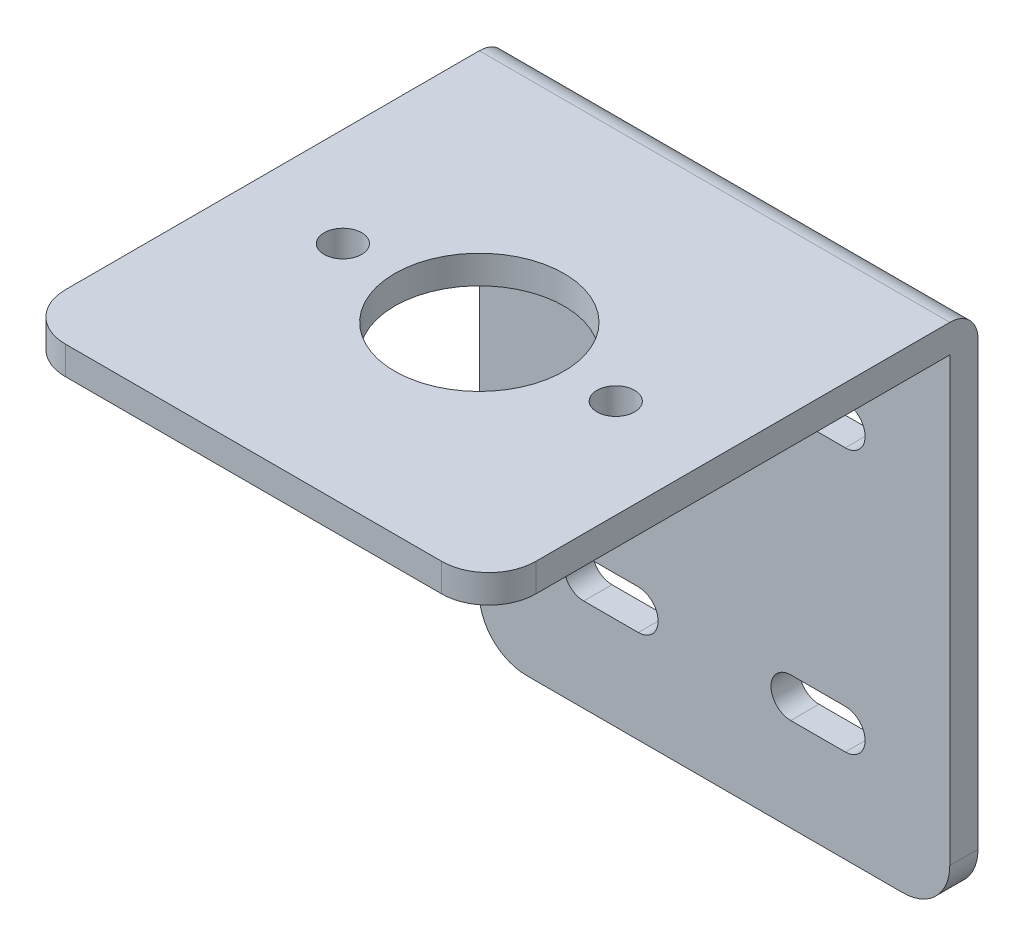
ISO-10303-21;
HEADER;
FILE_DESCRIPTION(('STEP AP214'),'2;1');
FILE_NAME('part.step','',(''),(''),'','','');
FILE_SCHEMA(('AUTOMOTIVE_DESIGN { 1 0 10303 214 1 1 1 1 }'));
ENDSEC;
DATA;
#1=APPLICATION_CONTEXT('core data for automotive mechanical design processes');
#2=APPLICATION_PROTOCOL_DEFINITION('international standard','automotive_design',2000,#1);
#3=PRODUCT_CONTEXT('',#1,'mechanical');
#4=PRODUCT('Part','Part','',(#3));
#5=PRODUCT_RELATED_PRODUCT_CATEGORY('part','',(#4));
#6=PRODUCT_DEFINITION_FORMATION('','',#4);
#7=PRODUCT_DEFINITION_CONTEXT('part definition',#1,'design');
#8=PRODUCT_DEFINITION('design','',#6,#7);
#9=PRODUCT_DEFINITION_SHAPE('','',#8);
#10=(LENGTH_UNIT() NAMED_UNIT(*) SI_UNIT(.MILLI.,.METRE.));
#11=(NAMED_UNIT(*) PLANE_ANGLE_UNIT() SI_UNIT($,.RADIAN.));
#12=(NAMED_UNIT(*) SI_UNIT($,.STERADIAN.) SOLID_ANGLE_UNIT());
#13=UNCERTAINTY_MEASURE_WITH_UNIT(LENGTH_MEASURE(1.E-05),#10,'distance_accuracy_value','');
#14=(GEOMETRIC_REPRESENTATION_CONTEXT(3) GLOBAL_UNCERTAINTY_ASSIGNED_CONTEXT((#13)) GLOBAL_UNIT_ASSIGNED_CONTEXT((#10,
#11,#12)) REPRESENTATION_CONTEXT('',''));
#15=CARTESIAN_POINT('',(0.,0.,0.));
#16=DIRECTION('',(0.,0.,1.));
#17=DIRECTION('',(1.,0.,0.));
#18=AXIS2_PLACEMENT_3D('',#15,#16,#17);
#19=CARTESIAN_POINT('',(50.,0.,0.));
#20=DIRECTION('',(0.,0.,-1.));
#21=DIRECTION('',(0.,-1.,0.));
#22=AXIS2_PLACEMENT_3D('',#19,#20,#21);
#23=PLANE('',#22);
#24=CARTESIAN_POINT('',(38.9,-12.,0.));
#25=DIRECTION('',(0.,0.,-1.));
#26=DIRECTION('',(0.707106781186548,0.707106781186548,0.));
#27=AXIS2_PLACEMENT_3D('',#24,#25,#26);
#28=CIRCLE('',#27,2.1);
#29=CARTESIAN_POINT('',(38.9,-9.9,0.));
#30=VERTEX_POINT('',#29);
#31=CARTESIAN_POINT('',(38.9,-14.1,0.));
#32=VERTEX_POINT('',#31);
#33=EDGE_CURVE('E595',#30,#32,#28,.T.);
#34=ORIENTED_EDGE('',*,*,#33,.F.);
#35=DIRECTION('',(1.,0.,0.));
#36=VECTOR('',#35,1.);
#37=CARTESIAN_POINT('',(31.,-9.9,0.));
#38=LINE('',#37,#36);
#39=CARTESIAN_POINT('',(33.1,-9.9,0.));
#40=VERTEX_POINT('',#39);
#41=EDGE_CURVE('E351',#40,#30,#38,.T.);
#42=ORIENTED_EDGE('',*,*,#41,.F.);
#43=CARTESIAN_POINT('',(33.1,-12.,0.));
#44=DIRECTION('',(0.,0.,-1.));
#45=DIRECTION('',(-0.707106781186548,-0.707106781186548,0.));
#46=AXIS2_PLACEMENT_3D('',#43,#44,#45);
#47=CIRCLE('',#46,2.1);
#48=CARTESIAN_POINT('',(33.1,-14.1,0.));
#49=VERTEX_POINT('',#48);
#50=EDGE_CURVE('E339',#49,#40,#47,.T.);
#51=ORIENTED_EDGE('',*,*,#50,.F.);
#52=DIRECTION('',(-1.,0.,0.));
#53=VECTOR('',#52,1.);
#54=CARTESIAN_POINT('',(41.,-14.1,0.));
#55=LINE('',#54,#53);
#56=EDGE_CURVE('E424',#32,#49,#55,.T.);
#57=ORIENTED_EDGE('',*,*,#56,.F.);
#58=EDGE_LOOP('',(#34,#42,#51,#57));
#59=FACE_BOUND('',#58,.T.);
#60=CARTESIAN_POINT('',(33.1,-40.,0.));
#61=DIRECTION('',(0.,0.,-1.));
#62=DIRECTION('',(-0.707106781186546,-0.707106781186549,0.));
#63=AXIS2_PLACEMENT_3D('',#60,#61,#62);
#64=CIRCLE('',#63,2.1);
#65=CARTESIAN_POINT('',(33.1,-42.1,0.));
#66=VERTEX_POINT('',#65);
#67=CARTESIAN_POINT('',(33.1,-37.9,0.));
#68=VERTEX_POINT('',#67);
#69=EDGE_CURVE('E25',#66,#68,#64,.T.);
#70=ORIENTED_EDGE('',*,*,#69,.F.);
#71=DIRECTION('',(-1.,0.,0.));
#72=VECTOR('',#71,1.);
#73=CARTESIAN_POINT('',(31.,-42.1,0.));
#74=LINE('',#73,#72);
#75=CARTESIAN_POINT('',(38.9000006109476,-42.1,0.));
#76=VERTEX_POINT('',#75);
#77=EDGE_CURVE('E329',#76,#66,#74,.T.);
#78=ORIENTED_EDGE('',*,*,#77,.F.);
#79=CARTESIAN_POINT('',(38.9000006109476,-40.,0.));
#80=DIRECTION('',(0.,0.,-1.));
#81=DIRECTION('',(0.707106781186548,0.707106781186548,0.));
#82=AXIS2_PLACEMENT_3D('',#79,#80,#81);
#83=CIRCLE('',#82,2.1);
#84=CARTESIAN_POINT('',(38.9000006109476,-37.9,0.));
#85=VERTEX_POINT('',#84);
#86=EDGE_CURVE('E427',#85,#76,#83,.T.);
#87=ORIENTED_EDGE('',*,*,#86,.F.);
#88=DIRECTION('',(1.,0.,0.));
#89=VECTOR('',#88,1.);
#90=CARTESIAN_POINT('',(41.0000006109476,-37.9,0.));
#91=LINE('',#90,#89);
#92=EDGE_CURVE('E493',#68,#85,#91,.T.);
#93=ORIENTED_EDGE('',*,*,#92,.F.);
#94=EDGE_LOOP('',(#70,#78,#87,#93));
#95=FACE_BOUND('',#94,.T.);
#96=CARTESIAN_POINT('',(16.9,-12.,0.));
#97=DIRECTION('',(0.,0.,-1.));
#98=DIRECTION('',(0.707106781186548,0.707106781186548,0.));
#99=AXIS2_PLACEMENT_3D('',#96,#97,#98);
#100=CIRCLE('',#99,2.1);
#101=CARTESIAN_POINT('',(16.9,-9.9,0.));
#102=VERTEX_POINT('',#101);
#103=CARTESIAN_POINT('',(16.9,-14.1,0.));
#104=VERTEX_POINT('',#103);
#105=EDGE_CURVE('E423',#102,#104,#100,.T.);
#106=ORIENTED_EDGE('',*,*,#105,.F.);
#107=DIRECTION('',(1.,0.,0.));
#108=VECTOR('',#107,1.);
#109=CARTESIAN_POINT('',(19.,-9.9,0.));
#110=LINE('',#109,#108);
#111=CARTESIAN_POINT('',(11.1,-9.9,0.));
#112=VERTEX_POINT('',#111);
#113=EDGE_CURVE('E484',#112,#102,#110,.T.);
#114=ORIENTED_EDGE('',*,*,#113,.F.);
#115=CARTESIAN_POINT('',(11.1,-12.,0.));
#116=DIRECTION('',(0.,0.,-1.));
#117=DIRECTION('',(-0.707106781186548,-0.707106781186548,0.));
#118=AXIS2_PLACEMENT_3D('',#115,#116,#117);
#119=CIRCLE('',#118,2.1);
#120=CARTESIAN_POINT('',(11.1,-14.1,0.));
#121=VERTEX_POINT('',#120);
#122=EDGE_CURVE('E39',#121,#112,#119,.T.);
#123=ORIENTED_EDGE('',*,*,#122,.F.);
#124=DIRECTION('',(-1.,0.,0.));
#125=VECTOR('',#124,1.);
#126=CARTESIAN_POINT('',(9.,-14.1,0.));
#127=LINE('',#126,#125);
#128=EDGE_CURVE('E359',#104,#121,#127,.T.);
#129=ORIENTED_EDGE('',*,*,#128,.F.);
#130=EDGE_LOOP('',(#106,#114,#123,#129));
#131=FACE_BOUND('',#130,.T.);
#132=CARTESIAN_POINT('',(16.9,-40.,0.));
#133=DIRECTION('',(0.,0.,-1.));
#134=DIRECTION('',(0.707106781186548,0.707106781186548,0.));
#135=AXIS2_PLACEMENT_3D('',#132,#133,#134);
#136=CIRCLE('',#135,2.1);
#137=CARTESIAN_POINT('',(16.9,-37.9,0.));
#138=VERTEX_POINT('',#137);
#139=CARTESIAN_POINT('',(16.9,-42.1,0.));
#140=VERTEX_POINT('',#139);
#141=EDGE_CURVE('E310',#138,#140,#136,.T.);
#142=ORIENTED_EDGE('',*,*,#141,.F.);
#143=DIRECTION('',(1.,0.,0.));
#144=VECTOR('',#143,1.);
#145=CARTESIAN_POINT('',(19.,-37.9,0.));
#146=LINE('',#145,#144);
#147=CARTESIAN_POINT('',(11.1,-37.9,0.));
#148=VERTEX_POINT('',#147);
#149=EDGE_CURVE('E294',#148,#138,#146,.T.);
#150=ORIENTED_EDGE('',*,*,#149,.F.);
#151=CARTESIAN_POINT('',(11.1,-40.,0.));
#152=DIRECTION('',(0.,0.,-1.));
#153=DIRECTION('',(-0.707106781186546,-0.707106781186549,0.));
#154=AXIS2_PLACEMENT_3D('',#151,#152,#153);
#155=CIRCLE('',#154,2.1);
#156=CARTESIAN_POINT('',(11.1,-42.1,0.));
#157=VERTEX_POINT('',#156);
#158=EDGE_CURVE('E9',#157,#148,#155,.T.);
#159=ORIENTED_EDGE('',*,*,#158,.F.);
#160=DIRECTION('',(-1.,0.,0.));
#161=VECTOR('',#160,1.);
#162=CARTESIAN_POINT('',(9.,-42.1,0.));
#163=LINE('',#162,#161);
#164=EDGE_CURVE('E314',#140,#157,#163,.T.);
#165=ORIENTED_EDGE('',*,*,#164,.F.);
#166=EDGE_LOOP('',(#142,#150,#159,#165));
#167=FACE_BOUND('',#166,.T.);
#168=DIRECTION('',(-1.,0.,0.));
#169=VECTOR('',#168,1.);
#170=CARTESIAN_POINT('',(50.,0.,0.));
#171=LINE('',#170,#169);
#172=CARTESIAN_POINT('',(50.,0.,0.));
#173=VERTEX_POINT('',#172);
#174=CARTESIAN_POINT('',(0.,0.,0.));
#175=VERTEX_POINT('',#174);
#176=EDGE_CURVE('E18',#173,#175,#171,.T.);
#177=ORIENTED_EDGE('',*,*,#176,.F.);
#178=DIRECTION('',(0.,-1.,0.));
#179=VECTOR('',#178,1.);
#180=CARTESIAN_POINT('',(50.,0.,0.));
#181=LINE('',#180,#179);
#182=CARTESIAN_POINT('',(50.,-47.,0.));
#183=VERTEX_POINT('',#182);
#184=EDGE_CURVE('E481',#173,#183,#181,.T.);
#185=ORIENTED_EDGE('',*,*,#184,.T.);
#186=CARTESIAN_POINT('',(45.,-47.,0.));
#187=DIRECTION('',(0.,0.,1.));
#188=DIRECTION('',(0.707106781186548,-0.707106781186548,0.));
#189=AXIS2_PLACEMENT_3D('',#186,#187,#188);
#190=CIRCLE('',#189,5.);
#191=CARTESIAN_POINT('',(45.,-52.,0.));
#192=VERTEX_POINT('',#191);
#193=EDGE_CURVE('E547',#192,#183,#190,.T.);
#194=ORIENTED_EDGE('',*,*,#193,.F.);
#195=DIRECTION('',(-1.,0.,0.));
#196=VECTOR('',#195,1.);
#197=CARTESIAN_POINT('',(50.,-52.,0.));
#198=LINE('',#197,#196);
#199=CARTESIAN_POINT('',(5.,-52.,0.));
#200=VERTEX_POINT('',#199);
#201=EDGE_CURVE('E519',#192,#200,#198,.T.);
#202=ORIENTED_EDGE('',*,*,#201,.T.);
#203=CARTESIAN_POINT('',(5.,-47.,0.));
#204=DIRECTION('',(0.,0.,1.));
#205=DIRECTION('',(-0.707106781186548,-0.707106781186548,0.));
#206=AXIS2_PLACEMENT_3D('',#203,#204,#205);
#207=CIRCLE('',#206,5.);
#208=CARTESIAN_POINT('',(0.,-47.,0.));
#209=VERTEX_POINT('',#208);
#210=EDGE_CURVE('E399',#209,#200,#207,.T.);
#211=ORIENTED_EDGE('',*,*,#210,.F.);
#212=DIRECTION('',(0.,1.,0.));
#213=VECTOR('',#212,1.);
#214=CARTESIAN_POINT('',(0.,0.,0.));
#215=LINE('',#214,#213);
#216=EDGE_CURVE('E350',#209,#175,#215,.T.);
#217=ORIENTED_EDGE('',*,*,#216,.T.);
#218=EDGE_LOOP('',(#177,#185,#194,#202,#211,#217));
#219=FACE_BOUND('',#218,.T.);
#220=ADVANCED_FACE('F14',(#59,#95,#131,#167,#219),#23,.T.);
#221=CARTESIAN_POINT('',(0.,0.,52.));
#222=DIRECTION('',(0.,0.,1.));
#223=DIRECTION('',(1.,0.,0.));
#224=AXIS2_PLACEMENT_3D('',#221,#222,#223);
#225=PLANE('',#224);
#226=DIRECTION('',(0.,-1.,0.));
#227=VECTOR('',#226,1.);
#228=CARTESIAN_POINT('',(45.,0.,52.));
#229=LINE('',#228,#227);
#230=CARTESIAN_POINT('',(45.,3.,52.));
#231=VERTEX_POINT('',#230);
#232=CARTESIAN_POINT('',(45.,0.,52.));
#233=VERTEX_POINT('',#232);
#234=EDGE_CURVE('E396',#231,#233,#229,.T.);
#235=ORIENTED_EDGE('',*,*,#234,.F.);
#236=DIRECTION('',(-1.,0.,0.));
#237=VECTOR('',#236,1.);
#238=CARTESIAN_POINT('',(0.,3.,52.));
#239=LINE('',#238,#237);
#240=CARTESIAN_POINT('',(5.,3.,52.));
#241=VERTEX_POINT('',#240);
#242=EDGE_CURVE('E380',#231,#241,#239,.T.);
#243=ORIENTED_EDGE('',*,*,#242,.T.);
#244=DIRECTION('',(0.,1.,0.));
#245=VECTOR('',#244,1.);
#246=CARTESIAN_POINT('',(5.,0.,52.));
#247=LINE('',#246,#245);
#248=CARTESIAN_POINT('',(5.,0.,52.));
#249=VERTEX_POINT('',#248);
#250=EDGE_CURVE('E409',#249,#241,#247,.T.);
#251=ORIENTED_EDGE('',*,*,#250,.F.);
#252=DIRECTION('',(1.,0.,0.));
#253=VECTOR('',#252,1.);
#254=CARTESIAN_POINT('',(0.,0.,52.));
#255=LINE('',#254,#253);
#256=EDGE_CURVE('E537',#249,#233,#255,.T.);
#257=ORIENTED_EDGE('',*,*,#256,.T.);
#258=EDGE_LOOP('',(#235,#243,#251,#257));
#259=FACE_BOUND('',#258,.T.);
#260=ADVANCED_FACE('F1323',(#259),#225,.T.);
#261=CARTESIAN_POINT('',(11.1,-40.,0.));
#262=DIRECTION('',(0.,0.,1.));
#263=DIRECTION('',(-0.707106781186546,-0.707106781186549,0.));
#264=AXIS2_PLACEMENT_3D('',#261,#262,#263);
#265=CYLINDRICAL_SURFACE('',#264,2.1);
#266=ORIENTED_EDGE('',*,*,#158,.T.);
#267=DIRECTION('',(0.,0.,1.));
#268=VECTOR('',#267,1.);
#269=CARTESIAN_POINT('',(11.1,-37.9,0.));
#270=LINE('',#269,#268);
#271=CARTESIAN_POINT('',(11.1,-37.9,3.));
#272=VERTEX_POINT('',#271);
#273=EDGE_CURVE('E300',#148,#272,#270,.T.);
#274=ORIENTED_EDGE('',*,*,#273,.T.);
#275=CARTESIAN_POINT('',(11.1,-40.,3.));
#276=DIRECTION('',(0.,0.,1.));
#277=DIRECTION('',(-0.707106781186548,0.707106781186548,0.));
#278=AXIS2_PLACEMENT_3D('',#275,#276,#277);
#279=CIRCLE('',#278,2.1);
#280=CARTESIAN_POINT('',(11.1,-42.1,3.));
#281=VERTEX_POINT('',#280);
#282=EDGE_CURVE('E361',#272,#281,#279,.T.);
#283=ORIENTED_EDGE('',*,*,#282,.T.);
#284=DIRECTION('',(0.,0.,-1.));
#285=VECTOR('',#284,1.);
#286=CARTESIAN_POINT('',(11.1,-42.1,0.));
#287=LINE('',#286,#285);
#288=EDGE_CURVE('E344',#281,#157,#287,.T.);
#289=ORIENTED_EDGE('',*,*,#288,.T.);
#290=EDGE_LOOP('',(#266,#274,#283,#289));
#291=FACE_BOUND('',#290,.T.);
#292=ADVANCED_FACE('F1315',(#291),#265,.F.);
#293=CARTESIAN_POINT('',(33.1,-40.,0.));
#294=DIRECTION('',(0.,0.,1.));
#295=DIRECTION('',(-0.707106781186546,-0.707106781186549,0.));
#296=AXIS2_PLACEMENT_3D('',#293,#294,#295);
#297=CYLINDRICAL_SURFACE('',#296,2.1);
#298=ORIENTED_EDGE('',*,*,#69,.T.);
#299=DIRECTION('',(0.,0.,1.));
#300=VECTOR('',#299,1.);
#301=CARTESIAN_POINT('',(33.1,-37.9,0.));
#302=LINE('',#301,#300);
#303=CARTESIAN_POINT('',(33.1,-37.9,3.));
#304=VERTEX_POINT('',#303);
#305=EDGE_CURVE('E354',#68,#304,#302,.T.);
#306=ORIENTED_EDGE('',*,*,#305,.T.);
#307=CARTESIAN_POINT('',(33.1,-40.,3.));
#308=DIRECTION('',(0.,0.,1.));
#309=DIRECTION('',(-0.707106781186548,0.707106781186548,0.));
#310=AXIS2_PLACEMENT_3D('',#307,#308,#309);
#311=CIRCLE('',#310,2.1);
#312=CARTESIAN_POINT('',(33.1,-42.1,3.));
#313=VERTEX_POINT('',#312);
#314=EDGE_CURVE('E428',#304,#313,#311,.T.);
#315=ORIENTED_EDGE('',*,*,#314,.T.);
#316=DIRECTION('',(0.,0.,-1.));
#317=VECTOR('',#316,1.);
#318=CARTESIAN_POINT('',(33.1,-42.1,0.));
#319=LINE('',#318,#317);
#320=EDGE_CURVE('E321',#313,#66,#319,.T.);
#321=ORIENTED_EDGE('',*,*,#320,.T.);
#322=EDGE_LOOP('',(#298,#306,#315,#321));
#323=FACE_BOUND('',#322,.T.);
#324=ADVANCED_FACE('F627',(#323),#297,.F.);
#325=CARTESIAN_POINT('',(11.1,-12.,0.));
#326=DIRECTION('',(0.,0.,1.));
#327=DIRECTION('',(-0.707106781186548,-0.707106781186548,0.));
#328=AXIS2_PLACEMENT_3D('',#325,#326,#327);
#329=CYLINDRICAL_SURFACE('',#328,2.1);
#330=ORIENTED_EDGE('',*,*,#122,.T.);
#331=DIRECTION('',(0.,0.,1.));
#332=VECTOR('',#331,1.);
#333=CARTESIAN_POINT('',(11.1,-9.9,0.));
#334=LINE('',#333,#332);
#335=CARTESIAN_POINT('',(11.1,-9.9,3.));
#336=VERTEX_POINT('',#335);
#337=EDGE_CURVE('E304',#112,#336,#334,.T.);
#338=ORIENTED_EDGE('',*,*,#337,.T.);
#339=CARTESIAN_POINT('',(11.1,-12.,3.));
#340=DIRECTION('',(0.,0.,1.));
#341=DIRECTION('',(-0.707106781186548,0.707106781186548,0.));
#342=AXIS2_PLACEMENT_3D('',#339,#340,#341);
#343=CIRCLE('',#342,2.1);
#344=CARTESIAN_POINT('',(11.1,-14.1,3.));
#345=VERTEX_POINT('',#344);
#346=EDGE_CURVE('E486',#336,#345,#343,.T.);
#347=ORIENTED_EDGE('',*,*,#346,.T.);
#348=DIRECTION('',(0.,0.,-1.));
#349=VECTOR('',#348,1.);
#350=CARTESIAN_POINT('',(11.1,-14.1,0.));
#351=LINE('',#350,#349);
#352=EDGE_CURVE('E408',#345,#121,#351,.T.);
#353=ORIENTED_EDGE('',*,*,#352,.T.);
#354=EDGE_LOOP('',(#330,#338,#347,#353));
#355=FACE_BOUND('',#354,.T.);
#356=ADVANCED_FACE('F646',(#355),#329,.F.);
#357=CARTESIAN_POINT('',(9.,-9.9,0.));
#358=DIRECTION('',(0.,-1.,0.));
#359=DIRECTION('',(0.,0.,-1.));
#360=AXIS2_PLACEMENT_3D('',#357,#358,#359);
#361=PLANE('',#360);
#362=DIRECTION('',(0.,0.,-1.));
#363=VECTOR('',#362,1.);
#364=CARTESIAN_POINT('',(16.9,-9.9,0.));
#365=LINE('',#364,#363);
#366=CARTESIAN_POINT('',(16.9,-9.9,3.));
#367=VERTEX_POINT('',#366);
#368=EDGE_CURVE('E355',#367,#102,#365,.T.);
#369=ORIENTED_EDGE('',*,*,#368,.F.);
#370=DIRECTION('',(1.,0.,0.));
#371=VECTOR('',#370,1.);
#372=CARTESIAN_POINT('',(19.,-9.9,3.));
#373=LINE('',#372,#371);
#374=EDGE_CURVE('E391',#336,#367,#373,.T.);
#375=ORIENTED_EDGE('',*,*,#374,.F.);
#376=ORIENTED_EDGE('',*,*,#337,.F.);
#377=ORIENTED_EDGE('',*,*,#113,.T.);
#378=EDGE_LOOP('',(#369,#375,#376,#377));
#379=FACE_BOUND('',#378,.T.);
#380=ADVANCED_FACE('F650',(#379),#361,.T.);
#381=CARTESIAN_POINT('',(9.,-37.9,0.));
#382=DIRECTION('',(0.,-1.,0.));
#383=DIRECTION('',(0.,0.,-1.));
#384=AXIS2_PLACEMENT_3D('',#381,#382,#383);
#385=PLANE('',#384);
#386=DIRECTION('',(0.,0.,-1.));
#387=VECTOR('',#386,1.);
#388=CARTESIAN_POINT('',(16.9,-37.9,0.));
#389=LINE('',#388,#387);
#390=CARTESIAN_POINT('',(16.9,-37.9,3.));
#391=VERTEX_POINT('',#390);
#392=EDGE_CURVE('E298',#391,#138,#389,.T.);
#393=ORIENTED_EDGE('',*,*,#392,.F.);
#394=DIRECTION('',(1.,0.,0.));
#395=VECTOR('',#394,1.);
#396=CARTESIAN_POINT('',(19.,-37.9,3.));
#397=LINE('',#396,#395);
#398=EDGE_CURVE('E365',#272,#391,#397,.T.);
#399=ORIENTED_EDGE('',*,*,#398,.F.);
#400=ORIENTED_EDGE('',*,*,#273,.F.);
#401=ORIENTED_EDGE('',*,*,#149,.T.);
#402=EDGE_LOOP('',(#393,#399,#400,#401));
#403=FACE_BOUND('',#402,.T.);
#404=ADVANCED_FACE('F296',(#403),#385,.T.);
#405=CARTESIAN_POINT('',(31.,-37.9,0.));
#406=DIRECTION('',(0.,-1.,0.));
#407=DIRECTION('',(0.,0.,-1.));
#408=AXIS2_PLACEMENT_3D('',#405,#406,#407);
#409=PLANE('',#408);
#410=DIRECTION('',(0.,0.,-1.));
#411=VECTOR('',#410,1.);
#412=CARTESIAN_POINT('',(38.9000006109476,-37.9,0.));
#413=LINE('',#412,#411);
#414=CARTESIAN_POINT('',(38.9000006109476,-37.9,3.));
#415=VERTEX_POINT('',#414);
#416=EDGE_CURVE('E556',#415,#85,#413,.T.);
#417=ORIENTED_EDGE('',*,*,#416,.F.);
#418=DIRECTION('',(1.,0.,0.));
#419=VECTOR('',#418,1.);
#420=CARTESIAN_POINT('',(41.0000006109476,-37.9,3.));
#421=LINE('',#420,#419);
#422=EDGE_CURVE('E528',#304,#415,#421,.T.);
#423=ORIENTED_EDGE('',*,*,#422,.F.);
#424=ORIENTED_EDGE('',*,*,#305,.F.);
#425=ORIENTED_EDGE('',*,*,#92,.T.);
#426=EDGE_LOOP('',(#417,#423,#424,#425));
#427=FACE_BOUND('',#426,.T.);
#428=ADVANCED_FACE('F607',(#427),#409,.T.);
#429=CARTESIAN_POINT('',(31.,-9.9,0.));
#430=DIRECTION('',(0.,-1.,0.));
#431=DIRECTION('',(0.,0.,-1.));
#432=AXIS2_PLACEMENT_3D('',#429,#430,#431);
#433=PLANE('',#432);
#434=DIRECTION('',(0.,0.,-1.));
#435=VECTOR('',#434,1.);
#436=CARTESIAN_POINT('',(38.9,-9.9,0.));
#437=LINE('',#436,#435);
#438=CARTESIAN_POINT('',(38.9,-9.9,3.));
#439=VERTEX_POINT('',#438);
#440=EDGE_CURVE('E456',#439,#30,#437,.T.);
#441=ORIENTED_EDGE('',*,*,#440,.F.);
#442=DIRECTION('',(1.,0.,0.));
#443=VECTOR('',#442,1.);
#444=CARTESIAN_POINT('',(31.,-9.9,3.));
#445=LINE('',#444,#443);
#446=CARTESIAN_POINT('',(33.1,-9.9,3.));
#447=VERTEX_POINT('',#446);
#448=EDGE_CURVE('E497',#447,#439,#445,.T.);
#449=ORIENTED_EDGE('',*,*,#448,.F.);
#450=DIRECTION('',(0.,0.,1.));
#451=VECTOR('',#450,1.);
#452=CARTESIAN_POINT('',(33.1,-9.9,0.));
#453=LINE('',#452,#451);
#454=EDGE_CURVE('E343',#40,#447,#453,.T.);
#455=ORIENTED_EDGE('',*,*,#454,.F.);
#456=ORIENTED_EDGE('',*,*,#41,.T.);
#457=EDGE_LOOP('',(#441,#449,#455,#456));
#458=FACE_BOUND('',#457,.T.);
#459=ADVANCED_FACE('F1271',(#458),#433,.T.);
#460=CARTESIAN_POINT('',(33.1,-12.,0.));
#461=DIRECTION('',(0.,0.,1.));
#462=DIRECTION('',(-0.707106781186548,0.707106781186548,0.));
#463=AXIS2_PLACEMENT_3D('',#460,#461,#462);
#464=CYLINDRICAL_SURFACE('',#463,2.1);
#465=ORIENTED_EDGE('',*,*,#50,.T.);
#466=ORIENTED_EDGE('',*,*,#454,.T.);
#467=CARTESIAN_POINT('',(33.1,-12.,3.));
#468=DIRECTION('',(0.,0.,1.));
#469=DIRECTION('',(-0.707106781186548,0.707106781186548,0.));
#470=AXIS2_PLACEMENT_3D('',#467,#468,#469);
#471=CIRCLE('',#470,2.1);
#472=CARTESIAN_POINT('',(33.1,-14.1,3.));
#473=VERTEX_POINT('',#472);
#474=EDGE_CURVE('E442',#447,#473,#471,.T.);
#475=ORIENTED_EDGE('',*,*,#474,.T.);
#476=DIRECTION('',(0.,0.,-1.));
#477=VECTOR('',#476,1.);
#478=CARTESIAN_POINT('',(33.1,-14.1,0.));
#479=LINE('',#478,#477);
#480=EDGE_CURVE('E419',#473,#49,#479,.T.);
#481=ORIENTED_EDGE('',*,*,#480,.T.);
#482=EDGE_LOOP('',(#465,#466,#475,#481));
#483=FACE_BOUND('',#482,.T.);
#484=ADVANCED_FACE('F16',(#483),#464,.F.);
#485=CARTESIAN_POINT('',(19.,-42.1,0.));
#486=DIRECTION('',(0.,1.,0.));
#487=DIRECTION('',(1.,0.,0.));
#488=AXIS2_PLACEMENT_3D('',#485,#486,#487);
#489=PLANE('',#488);
#490=DIRECTION('',(0.,0.,1.));
#491=VECTOR('',#490,1.);
#492=CARTESIAN_POINT('',(16.9,-42.1,0.));
#493=LINE('',#492,#491);
#494=CARTESIAN_POINT('',(16.9,-42.1,3.));
#495=VERTEX_POINT('',#494);
#496=EDGE_CURVE('E315',#140,#495,#493,.T.);
#497=ORIENTED_EDGE('',*,*,#496,.F.);
#498=ORIENTED_EDGE('',*,*,#164,.T.);
#499=ORIENTED_EDGE('',*,*,#288,.F.);
#500=DIRECTION('',(-1.,0.,0.));
#501=VECTOR('',#500,1.);
#502=CARTESIAN_POINT('',(9.,-42.1,3.));
#503=LINE('',#502,#501);
#504=EDGE_CURVE('E366',#495,#281,#503,.T.);
#505=ORIENTED_EDGE('',*,*,#504,.F.);
#506=EDGE_LOOP('',(#497,#498,#499,#505));
#507=FACE_BOUND('',#506,.T.);
#508=ADVANCED_FACE('F1255',(#507),#489,.T.);
#509=CARTESIAN_POINT('',(16.9,-40.,0.));
#510=DIRECTION('',(0.,0.,1.));
#511=DIRECTION('',(0.707106781186546,-0.707106781186549,0.));
#512=AXIS2_PLACEMENT_3D('',#509,#510,#511);
#513=CYLINDRICAL_SURFACE('',#512,2.1);
#514=ORIENTED_EDGE('',*,*,#141,.T.);
#515=ORIENTED_EDGE('',*,*,#496,.T.);
#516=CARTESIAN_POINT('',(16.9,-40.,3.));
#517=DIRECTION('',(0.,0.,1.));
#518=DIRECTION('',(0.707106781186546,-0.707106781186549,0.));
#519=AXIS2_PLACEMENT_3D('',#516,#517,#518);
#520=CIRCLE('',#519,2.1);
#521=EDGE_CURVE('E312',#495,#391,#520,.T.);
#522=ORIENTED_EDGE('',*,*,#521,.T.);
#523=ORIENTED_EDGE('',*,*,#392,.T.);
#524=EDGE_LOOP('',(#514,#515,#522,#523));
#525=FACE_BOUND('',#524,.T.);
#526=ADVANCED_FACE('F309',(#525),#513,.F.);
#527=CARTESIAN_POINT('',(41.0000006109476,-42.1,0.));
#528=DIRECTION('',(0.,1.,0.));
#529=DIRECTION('',(1.,0.,0.));
#530=AXIS2_PLACEMENT_3D('',#527,#528,#529);
#531=PLANE('',#530);
#532=DIRECTION('',(0.,0.,1.));
#533=VECTOR('',#532,1.);
#534=CARTESIAN_POINT('',(38.9000006109476,-42.1,0.));
#535=LINE('',#534,#533);
#536=CARTESIAN_POINT('',(38.9000006109476,-42.1,3.));
#537=VERTEX_POINT('',#536);
#538=EDGE_CURVE('E464',#76,#537,#535,.T.);
#539=ORIENTED_EDGE('',*,*,#538,.F.);
#540=ORIENTED_EDGE('',*,*,#77,.T.);
#541=ORIENTED_EDGE('',*,*,#320,.F.);
#542=DIRECTION('',(-1.,0.,0.));
#543=VECTOR('',#542,1.);
#544=CARTESIAN_POINT('',(31.,-42.1,3.));
#545=LINE('',#544,#543);
#546=EDGE_CURVE('E433',#537,#313,#545,.T.);
#547=ORIENTED_EDGE('',*,*,#546,.F.);
#548=EDGE_LOOP('',(#539,#540,#541,#547));
#549=FACE_BOUND('',#548,.T.);
#550=ADVANCED_FACE('F619',(#549),#531,.T.);
#551=CARTESIAN_POINT('',(38.9000006109476,-40.,0.));
#552=DIRECTION('',(0.,0.,1.));
#553=DIRECTION('',(0.707106781186546,-0.707106781186549,0.));
#554=AXIS2_PLACEMENT_3D('',#551,#552,#553);
#555=CYLINDRICAL_SURFACE('',#554,2.1);
#556=ORIENTED_EDGE('',*,*,#86,.T.);
#557=ORIENTED_EDGE('',*,*,#538,.T.);
#558=CARTESIAN_POINT('',(38.9000006109476,-40.,3.));
#559=DIRECTION('',(0.,0.,1.));
#560=DIRECTION('',(0.707106781186546,-0.707106781186549,0.));
#561=AXIS2_PLACEMENT_3D('',#558,#559,#560);
#562=CIRCLE('',#561,2.1);
#563=EDGE_CURVE('E532',#537,#415,#562,.T.);
#564=ORIENTED_EDGE('',*,*,#563,.T.);
#565=ORIENTED_EDGE('',*,*,#416,.T.);
#566=EDGE_LOOP('',(#556,#557,#564,#565));
#567=FACE_BOUND('',#566,.T.);
#568=ADVANCED_FACE('F612',(#567),#555,.F.);
#569=CARTESIAN_POINT('',(19.,-14.1,0.));
#570=DIRECTION('',(0.,1.,0.));
#571=DIRECTION('',(1.,0.,0.));
#572=AXIS2_PLACEMENT_3D('',#569,#570,#571);
#573=PLANE('',#572);
#574=DIRECTION('',(0.,0.,1.));
#575=VECTOR('',#574,1.);
#576=CARTESIAN_POINT('',(16.9,-14.1,0.));
#577=LINE('',#576,#575);
#578=CARTESIAN_POINT('',(16.9,-14.1,3.));
#579=VERTEX_POINT('',#578);
#580=EDGE_CURVE('E360',#104,#579,#577,.T.);
#581=ORIENTED_EDGE('',*,*,#580,.F.);
#582=ORIENTED_EDGE('',*,*,#128,.T.);
#583=ORIENTED_EDGE('',*,*,#352,.F.);
#584=DIRECTION('',(-1.,0.,0.));
#585=VECTOR('',#584,1.);
#586=CARTESIAN_POINT('',(9.,-14.1,3.));
#587=LINE('',#586,#585);
#588=EDGE_CURVE('E489',#579,#345,#587,.T.);
#589=ORIENTED_EDGE('',*,*,#588,.F.);
#590=EDGE_LOOP('',(#581,#582,#583,#589));
#591=FACE_BOUND('',#590,.T.);
#592=ADVANCED_FACE('F645',(#591),#573,.T.);
#593=CARTESIAN_POINT('',(16.9,-12.,0.));
#594=DIRECTION('',(0.,0.,1.));
#595=DIRECTION('',(0.707106781186548,-0.707106781186548,0.));
#596=AXIS2_PLACEMENT_3D('',#593,#594,#595);
#597=CYLINDRICAL_SURFACE('',#596,2.1);
#598=ORIENTED_EDGE('',*,*,#105,.T.);
#599=ORIENTED_EDGE('',*,*,#580,.T.);
#600=CARTESIAN_POINT('',(16.9,-12.,3.));
#601=DIRECTION('',(0.,0.,1.));
#602=DIRECTION('',(0.707106781186548,-0.707106781186548,0.));
#603=AXIS2_PLACEMENT_3D('',#600,#601,#602);
#604=CIRCLE('',#603,2.1);
#605=EDGE_CURVE('E432',#579,#367,#604,.T.);
#606=ORIENTED_EDGE('',*,*,#605,.T.);
#607=ORIENTED_EDGE('',*,*,#368,.T.);
#608=EDGE_LOOP('',(#598,#599,#606,#607));
#609=FACE_BOUND('',#608,.T.);
#610=ADVANCED_FACE('F1209',(#609),#597,.F.);
#611=CARTESIAN_POINT('',(41.,-14.1,0.));
#612=DIRECTION('',(0.,1.,0.));
#613=DIRECTION('',(1.,0.,0.));
#614=AXIS2_PLACEMENT_3D('',#611,#612,#613);
#615=PLANE('',#614);
#616=DIRECTION('',(0.,0.,1.));
#617=VECTOR('',#616,1.);
#618=CARTESIAN_POINT('',(38.9,-14.1,0.));
#619=LINE('',#618,#617);
#620=CARTESIAN_POINT('',(38.9,-14.1,3.));
#621=VERTEX_POINT('',#620);
#622=EDGE_CURVE('E460',#32,#621,#619,.T.);
#623=ORIENTED_EDGE('',*,*,#622,.F.);
#624=ORIENTED_EDGE('',*,*,#56,.T.);
#625=ORIENTED_EDGE('',*,*,#480,.F.);
#626=DIRECTION('',(-1.,0.,0.));
#627=VECTOR('',#626,1.);
#628=CARTESIAN_POINT('',(41.,-14.1,3.));
#629=LINE('',#628,#627);
#630=EDGE_CURVE('E439',#621,#473,#629,.T.);
#631=ORIENTED_EDGE('',*,*,#630,.F.);
#632=EDGE_LOOP('',(#623,#624,#625,#631));
#633=FACE_BOUND('',#632,.T.);
#634=ADVANCED_FACE('F1198',(#633),#615,.T.);
#635=CARTESIAN_POINT('',(38.9,-12.,0.));
#636=DIRECTION('',(0.,0.,1.));
#637=DIRECTION('',(0.707106781186548,-0.707106781186548,0.));
#638=AXIS2_PLACEMENT_3D('',#635,#636,#637);
#639=CYLINDRICAL_SURFACE('',#638,2.1);
#640=ORIENTED_EDGE('',*,*,#33,.T.);
#641=ORIENTED_EDGE('',*,*,#622,.T.);
#642=CARTESIAN_POINT('',(38.9,-12.,3.));
#643=DIRECTION('',(0.,0.,1.));
#644=DIRECTION('',(0.707106781186548,-0.707106781186548,0.));
#645=AXIS2_PLACEMENT_3D('',#642,#643,#644);
#646=CIRCLE('',#645,2.1);
#647=EDGE_CURVE('E524',#621,#439,#646,.T.);
#648=ORIENTED_EDGE('',*,*,#647,.T.);
#649=ORIENTED_EDGE('',*,*,#440,.T.);
#650=EDGE_LOOP('',(#640,#641,#648,#649));
#651=FACE_BOUND('',#650,.T.);
#652=ADVANCED_FACE('F1188',(#651),#639,.F.);
#653=CARTESIAN_POINT('',(5.,-47.,0.));
#654=DIRECTION('',(0.,0.,1.));
#655=DIRECTION('',(-0.707106781186548,-0.707106781186548,0.));
#656=AXIS2_PLACEMENT_3D('',#653,#654,#655);
#657=CYLINDRICAL_SURFACE('',#656,5.);
#658=CARTESIAN_POINT('',(5.,-47.,3.));
#659=DIRECTION('',(0.,0.,-1.));
#660=DIRECTION('',(-0.707106781186548,-0.707106781186548,0.));
#661=AXIS2_PLACEMENT_3D('',#658,#659,#660);
#662=CIRCLE('',#661,5.);
#663=CARTESIAN_POINT('',(5.,-52.,3.));
#664=VERTEX_POINT('',#663);
#665=CARTESIAN_POINT('',(0.,-47.,3.));
#666=VERTEX_POINT('',#665);
#667=EDGE_CURVE('E443',#664,#666,#662,.T.);
#668=ORIENTED_EDGE('',*,*,#667,.T.);
#669=DIRECTION('',(0.,0.,-1.));
#670=VECTOR('',#669,1.);
#671=CARTESIAN_POINT('',(0.,-47.,0.));
#672=LINE('',#671,#670);
#673=EDGE_CURVE('E345',#666,#209,#672,.T.);
#674=ORIENTED_EDGE('',*,*,#673,.T.);
#675=ORIENTED_EDGE('',*,*,#210,.T.);
#676=DIRECTION('',(0.,0.,1.));
#677=VECTOR('',#676,1.);
#678=CARTESIAN_POINT('',(5.,-52.,0.));
#679=LINE('',#678,#677);
#680=EDGE_CURVE('E523',#200,#664,#679,.T.);
#681=ORIENTED_EDGE('',*,*,#680,.T.);
#682=EDGE_LOOP('',(#668,#674,#675,#681));
#683=FACE_BOUND('',#682,.T.);
#684=ADVANCED_FACE('F1179',(#683),#657,.T.);
#685=CARTESIAN_POINT('',(25.,-26.,3.));
#686=DIRECTION('',(0.,0.,1.));
#687=DIRECTION('',(1.,0.,0.));
#688=AXIS2_PLACEMENT_3D('',#685,#686,#687);
#689=PLANE('',#688);
#690=ORIENTED_EDGE('',*,*,#521,.F.);
#691=ORIENTED_EDGE('',*,*,#504,.T.);
#692=ORIENTED_EDGE('',*,*,#282,.F.);
#693=ORIENTED_EDGE('',*,*,#398,.T.);
#694=EDGE_LOOP('',(#690,#691,#692,#693));
#695=FACE_BOUND('',#694,.T.);
#696=ORIENTED_EDGE('',*,*,#605,.F.);
#697=ORIENTED_EDGE('',*,*,#588,.T.);
#698=ORIENTED_EDGE('',*,*,#346,.F.);
#699=ORIENTED_EDGE('',*,*,#374,.T.);
#700=EDGE_LOOP('',(#696,#697,#698,#699));
#701=FACE_BOUND('',#700,.T.);
#702=ORIENTED_EDGE('',*,*,#422,.T.);
#703=ORIENTED_EDGE('',*,*,#563,.F.);
#704=ORIENTED_EDGE('',*,*,#546,.T.);
#705=ORIENTED_EDGE('',*,*,#314,.F.);
#706=EDGE_LOOP('',(#702,#703,#704,#705));
#707=FACE_BOUND('',#706,.T.);
#708=ORIENTED_EDGE('',*,*,#630,.T.);
#709=ORIENTED_EDGE('',*,*,#474,.F.);
#710=ORIENTED_EDGE('',*,*,#448,.T.);
#711=ORIENTED_EDGE('',*,*,#647,.F.);
#712=EDGE_LOOP('',(#708,#709,#710,#711));
#713=FACE_BOUND('',#712,.T.);
#714=CARTESIAN_POINT('',(45.,-47.,3.));
#715=DIRECTION('',(0.,0.,-1.));
#716=DIRECTION('',(0.707106781186548,-0.707106781186548,0.));
#717=AXIS2_PLACEMENT_3D('',#714,#715,#716);
#718=CIRCLE('',#717,5.);
#719=CARTESIAN_POINT('',(50.,-47.,3.));
#720=VERTEX_POINT('',#719);
#721=CARTESIAN_POINT('',(45.,-52.,3.));
#722=VERTEX_POINT('',#721);
#723=EDGE_CURVE('E514',#720,#722,#718,.T.);
#724=ORIENTED_EDGE('',*,*,#723,.F.);
#725=DIRECTION('',(0.,1.,0.));
#726=VECTOR('',#725,1.);
#727=CARTESIAN_POINT('',(50.,0.,3.));
#728=LINE('',#727,#726);
#729=CARTESIAN_POINT('',(50.,0.,3.));
#730=VERTEX_POINT('',#729);
#731=EDGE_CURVE('E482',#720,#730,#728,.T.);
#732=ORIENTED_EDGE('',*,*,#731,.T.);
#733=DIRECTION('',(1.,0.,0.));
#734=VECTOR('',#733,1.);
#735=CARTESIAN_POINT('',(37.5,0.,3.));
#736=LINE('',#735,#734);
#737=CARTESIAN_POINT('',(0.,0.,3.));
#738=VERTEX_POINT('',#737);
#739=EDGE_CURVE('E334',#738,#730,#736,.T.);
#740=ORIENTED_EDGE('',*,*,#739,.F.);
#741=DIRECTION('',(0.,-1.,0.));
#742=VECTOR('',#741,1.);
#743=CARTESIAN_POINT('',(0.,-52.,3.));
#744=LINE('',#743,#742);
#745=EDGE_CURVE('E349',#738,#666,#744,.T.);
#746=ORIENTED_EDGE('',*,*,#745,.T.);
#747=ORIENTED_EDGE('',*,*,#667,.F.);
#748=DIRECTION('',(1.,0.,0.));
#749=VECTOR('',#748,1.);
#750=CARTESIAN_POINT('',(50.,-52.,3.));
#751=LINE('',#750,#749);
#752=EDGE_CURVE('E540',#664,#722,#751,.T.);
#753=ORIENTED_EDGE('',*,*,#752,.T.);
#754=EDGE_LOOP('',(#724,#732,#740,#746,#747,#753));
#755=FACE_BOUND('',#754,.T.);
#756=ADVANCED_FACE('F624',(#695,#701,#707,#713,#755),#689,.T.);
#757=CARTESIAN_POINT('',(0.,-52.,0.));
#758=DIRECTION('',(0.,-1.,0.));
#759=DIRECTION('',(0.,0.,-1.));
#760=AXIS2_PLACEMENT_3D('',#757,#758,#759);
#761=PLANE('',#760);
#762=DIRECTION('',(0.,0.,-1.));
#763=VECTOR('',#762,1.);
#764=CARTESIAN_POINT('',(45.,-52.,0.));
#765=LINE('',#764,#763);
#766=EDGE_CURVE('E518',#722,#192,#765,.T.);
#767=ORIENTED_EDGE('',*,*,#766,.F.);
#768=ORIENTED_EDGE('',*,*,#752,.F.);
#769=ORIENTED_EDGE('',*,*,#680,.F.);
#770=ORIENTED_EDGE('',*,*,#201,.F.);
#771=EDGE_LOOP('',(#767,#768,#769,#770));
#772=FACE_BOUND('',#771,.T.);
#773=ADVANCED_FACE('F1156',(#772),#761,.T.);
#774=CARTESIAN_POINT('',(45.,-47.,0.));
#775=DIRECTION('',(0.,0.,1.));
#776=DIRECTION('',(0.707106781186548,-0.707106781186548,0.));
#777=AXIS2_PLACEMENT_3D('',#774,#775,#776);
#778=CYLINDRICAL_SURFACE('',#777,5.);
#779=ORIENTED_EDGE('',*,*,#723,.T.);
#780=ORIENTED_EDGE('',*,*,#766,.T.);
#781=ORIENTED_EDGE('',*,*,#193,.T.);
#782=DIRECTION('',(0.,0.,1.));
#783=VECTOR('',#782,1.);
#784=CARTESIAN_POINT('',(50.,-47.,0.));
#785=LINE('',#784,#783);
#786=EDGE_CURVE('E477',#183,#720,#785,.T.);
#787=ORIENTED_EDGE('',*,*,#786,.T.);
#788=EDGE_LOOP('',(#779,#780,#781,#787));
#789=FACE_BOUND('',#788,.T.);
#790=ADVANCED_FACE('F1146',(#789),#778,.T.);
#791=CARTESIAN_POINT('',(10.5,0.,28.));
#792=DIRECTION('',(0.,1.,0.));
#793=DIRECTION('',(1.,0.,0.));
#794=AXIS2_PLACEMENT_3D('',#791,#792,#793);
#795=CYLINDRICAL_SURFACE('',#794,2.);
#796=CARTESIAN_POINT('',(10.5,0.,28.));
#797=DIRECTION('',(0.,1.,0.));
#798=DIRECTION('',(1.,0.,0.));
#799=AXIS2_PLACEMENT_3D('',#796,#797,#798);
#800=CIRCLE('',#799,2.);
#801=CARTESIAN_POINT('',(8.5,0.,28.));
#802=VERTEX_POINT('',#801);
#803=EDGE_CURVE('E404',#802,#802,#800,.T.);
#804=ORIENTED_EDGE('',*,*,#803,.F.);
#805=DIRECTION('',(0.,1.,0.));
#806=VECTOR('',#805,1.);
#807=CARTESIAN_POINT('',(8.5,0.,28.));
#808=LINE('',#807,#806);
#809=CARTESIAN_POINT('',(8.5,3.,28.));
#810=VERTEX_POINT('',#809);
#811=EDGE_CURVE('E157',#802,#810,#808,.T.);
#812=ORIENTED_EDGE('',*,*,#811,.T.);
#813=CARTESIAN_POINT('',(10.5,3.,28.));
#814=DIRECTION('',(0.,-1.,0.));
#815=DIRECTION('',(1.,0.,0.));
#816=AXIS2_PLACEMENT_3D('',#813,#814,#815);
#817=CIRCLE('',#816,2.);
#818=EDGE_CURVE('E372',#810,#810,#817,.T.);
#819=ORIENTED_EDGE('',*,*,#818,.F.);
#820=ORIENTED_EDGE('',*,*,#811,.F.);
#821=EDGE_LOOP('',(#804,#812,#819,#820));
#822=FACE_BOUND('',#821,.T.);
#823=ADVANCED_FACE('F1136',(#822),#795,.F.);
#824=CARTESIAN_POINT('',(39.5,0.,28.));
#825=DIRECTION('',(0.,1.,0.));
#826=DIRECTION('',(1.,0.,0.));
#827=AXIS2_PLACEMENT_3D('',#824,#825,#826);
#828=CYLINDRICAL_SURFACE('',#827,2.);
#829=CARTESIAN_POINT('',(39.5,0.,28.));
#830=DIRECTION('',(0.,1.,0.));
#831=DIRECTION('',(1.,0.,0.));
#832=AXIS2_PLACEMENT_3D('',#829,#830,#831);
#833=CIRCLE('',#832,2.);
#834=CARTESIAN_POINT('',(37.5,0.,28.));
#835=VERTEX_POINT('',#834);
#836=EDGE_CURVE('E400',#835,#835,#833,.T.);
#837=ORIENTED_EDGE('',*,*,#836,.F.);
#838=DIRECTION('',(0.,1.,0.));
#839=VECTOR('',#838,1.);
#840=CARTESIAN_POINT('',(37.5,0.,28.));
#841=LINE('',#840,#839);
#842=CARTESIAN_POINT('',(37.5,3.,28.));
#843=VERTEX_POINT('',#842);
#844=EDGE_CURVE('E473',#835,#843,#841,.T.);
#845=ORIENTED_EDGE('',*,*,#844,.T.);
#846=CARTESIAN_POINT('',(39.5,3.,28.));
#847=DIRECTION('',(0.,-1.,0.));
#848=DIRECTION('',(1.,0.,0.));
#849=AXIS2_PLACEMENT_3D('',#846,#847,#848);
#850=CIRCLE('',#849,2.);
#851=EDGE_CURVE('E378',#843,#843,#850,.T.);
#852=ORIENTED_EDGE('',*,*,#851,.F.);
#853=ORIENTED_EDGE('',*,*,#844,.F.);
#854=EDGE_LOOP('',(#837,#845,#852,#853));
#855=FACE_BOUND('',#854,.T.);
#856=ADVANCED_FACE('F1123',(#855),#828,.F.);
#857=CARTESIAN_POINT('',(25.,0.,28.));
#858=DIRECTION('',(0.,1.,0.));
#859=DIRECTION('',(1.,0.,0.));
#860=AXIS2_PLACEMENT_3D('',#857,#858,#859);
#861=CYLINDRICAL_SURFACE('',#860,9.);
#862=CARTESIAN_POINT('',(25.,0.,28.));
#863=DIRECTION('',(0.,1.,0.));
#864=DIRECTION('',(1.,0.,0.));
#865=AXIS2_PLACEMENT_3D('',#862,#863,#864);
#866=CIRCLE('',#865,9.);
#867=CARTESIAN_POINT('',(16.,0.,28.));
#868=VERTEX_POINT('',#867);
#869=EDGE_CURVE('E337',#868,#868,#866,.T.);
#870=ORIENTED_EDGE('',*,*,#869,.F.);
#871=DIRECTION('',(0.,1.,0.));
#872=VECTOR('',#871,1.);
#873=CARTESIAN_POINT('',(16.,0.,28.));
#874=LINE('',#873,#872);
#875=CARTESIAN_POINT('',(16.,3.,28.));
#876=VERTEX_POINT('',#875);
#877=EDGE_CURVE('E412',#868,#876,#874,.T.);
#878=ORIENTED_EDGE('',*,*,#877,.T.);
#879=CARTESIAN_POINT('',(25.,3.,28.));
#880=DIRECTION('',(0.,-1.,0.));
#881=DIRECTION('',(1.,0.,0.));
#882=AXIS2_PLACEMENT_3D('',#879,#880,#881);
#883=CIRCLE('',#882,9.);
#884=EDGE_CURVE('E505',#876,#876,#883,.T.);
#885=ORIENTED_EDGE('',*,*,#884,.F.);
#886=ORIENTED_EDGE('',*,*,#877,.F.);
#887=EDGE_LOOP('',(#870,#878,#885,#886));
#888=FACE_BOUND('',#887,.T.);
#889=ADVANCED_FACE('F1108',(#888),#861,.F.);
#890=CARTESIAN_POINT('',(5.,0.,47.));
#891=DIRECTION('',(0.,-1.,0.));
#892=DIRECTION('',(-0.707106781186548,0.,0.707106781186548));
#893=AXIS2_PLACEMENT_3D('',#890,#891,#892);
#894=CYLINDRICAL_SURFACE('',#893,5.);
#895=CARTESIAN_POINT('',(5.,0.,47.));
#896=DIRECTION('',(0.,1.,0.));
#897=DIRECTION('',(-0.707106781186548,0.,0.707106781186548));
#898=AXIS2_PLACEMENT_3D('',#895,#896,#897);
#899=CIRCLE('',#898,5.);
#900=CARTESIAN_POINT('',(0.,0.,47.));
#901=VERTEX_POINT('',#900);
#902=EDGE_CURVE('E338',#901,#249,#899,.T.);
#903=ORIENTED_EDGE('',*,*,#902,.T.);
#904=ORIENTED_EDGE('',*,*,#250,.T.);
#905=CARTESIAN_POINT('',(5.,3.,47.));
#906=DIRECTION('',(0.,-1.,0.));
#907=DIRECTION('',(-0.707106781186548,0.,0.707106781186548));
#908=AXIS2_PLACEMENT_3D('',#905,#906,#907);
#909=CIRCLE('',#908,5.);
#910=CARTESIAN_POINT('',(0.,3.,47.));
#911=VERTEX_POINT('',#910);
#912=EDGE_CURVE('E387',#241,#911,#909,.T.);
#913=ORIENTED_EDGE('',*,*,#912,.T.);
#914=DIRECTION('',(0.,-1.,0.));
#915=VECTOR('',#914,1.);
#916=CARTESIAN_POINT('',(0.,0.,47.));
#917=LINE('',#916,#915);
#918=EDGE_CURVE('E452',#911,#901,#917,.T.);
#919=ORIENTED_EDGE('',*,*,#918,.T.);
#920=EDGE_LOOP('',(#903,#904,#913,#919));
#921=FACE_BOUND('',#920,.T.);
#922=ADVANCED_FACE('F1093',(#921),#894,.T.);
#923=CARTESIAN_POINT('',(50.,0.,0.));
#924=DIRECTION('',(0.,1.,0.));
#925=DIRECTION('',(1.,0.,0.));
#926=AXIS2_PLACEMENT_3D('',#923,#924,#925);
#927=PLANE('',#926);
#928=ORIENTED_EDGE('',*,*,#803,.T.);
#929=EDGE_LOOP('',(#928));
#930=FACE_BOUND('',#929,.T.);
#931=ORIENTED_EDGE('',*,*,#836,.T.);
#932=EDGE_LOOP('',(#931));
#933=FACE_BOUND('',#932,.T.);
#934=ORIENTED_EDGE('',*,*,#869,.T.);
#935=EDGE_LOOP('',(#934));
#936=FACE_BOUND('',#935,.T.);
#937=CARTESIAN_POINT('',(45.,0.,47.));
#938=DIRECTION('',(0.,1.,0.));
#939=DIRECTION('',(0.707106781186548,0.,0.707106781186548));
#940=AXIS2_PLACEMENT_3D('',#937,#938,#939);
#941=CIRCLE('',#940,5.);
#942=CARTESIAN_POINT('',(50.,0.,47.));
#943=VERTEX_POINT('',#942);
#944=EDGE_CURVE('E393',#233,#943,#941,.T.);
#945=ORIENTED_EDGE('',*,*,#944,.F.);
#946=ORIENTED_EDGE('',*,*,#256,.F.);
#947=ORIENTED_EDGE('',*,*,#902,.F.);
#948=DIRECTION('',(0.,0.,1.));
#949=VECTOR('',#948,1.);
#950=CARTESIAN_POINT('',(0.,0.,0.));
#951=LINE('',#950,#949);
#952=EDGE_CURVE('E448',#738,#901,#951,.T.);
#953=ORIENTED_EDGE('',*,*,#952,.F.);
#954=ORIENTED_EDGE('',*,*,#739,.T.);
#955=DIRECTION('',(0.,0.,1.));
#956=VECTOR('',#955,1.);
#957=CARTESIAN_POINT('',(50.,0.,3.));
#958=LINE('',#957,#956);
#959=EDGE_CURVE('E467',#730,#943,#958,.T.);
#960=ORIENTED_EDGE('',*,*,#959,.T.);
#961=EDGE_LOOP('',(#945,#946,#947,#953,#954,#960));
#962=FACE_BOUND('',#961,.T.);
#963=ADVANCED_FACE('F1079',(#930,#933,#936,#962),#927,.F.);
#964=CARTESIAN_POINT('',(50.,0.,3.));
#965=DIRECTION('',(1.,0.,0.));
#966=DIRECTION('',(0.,1.,0.));
#967=AXIS2_PLACEMENT_3D('',#964,#965,#966);
#968=PLANE('',#967);
#969=CARTESIAN_POINT('',(50.,0.,3.));
#970=DIRECTION('',(-1.,0.,0.));
#971=DIRECTION('',(0.,0.707106781186548,-0.707106781186548));
#972=AXIS2_PLACEMENT_3D('',#969,#970,#971);
#973=CIRCLE('',#972,3.);
#974=CARTESIAN_POINT('',(50.,3.,3.));
#975=VERTEX_POINT('',#974);
#976=EDGE_CURVE('E589',#975,#173,#973,.T.);
#977=ORIENTED_EDGE('',*,*,#976,.F.);
#978=DIRECTION('',(0.,0.,1.));
#979=VECTOR('',#978,1.);
#980=CARTESIAN_POINT('',(50.,3.,3.));
#981=LINE('',#980,#979);
#982=CARTESIAN_POINT('',(50.,3.,47.));
#983=VERTEX_POINT('',#982);
#984=EDGE_CURVE('E214',#975,#983,#981,.T.);
#985=ORIENTED_EDGE('',*,*,#984,.T.);
#986=DIRECTION('',(0.,1.,0.));
#987=VECTOR('',#986,1.);
#988=CARTESIAN_POINT('',(50.,0.,47.));
#989=LINE('',#988,#987);
#990=EDGE_CURVE('E144',#943,#983,#989,.T.);
#991=ORIENTED_EDGE('',*,*,#990,.F.);
#992=ORIENTED_EDGE('',*,*,#959,.F.);
#993=ORIENTED_EDGE('',*,*,#731,.F.);
#994=ORIENTED_EDGE('',*,*,#786,.F.);
#995=ORIENTED_EDGE('',*,*,#184,.F.);
#996=EDGE_LOOP('',(#977,#985,#991,#992,#993,#994,#995));
#997=FACE_BOUND('',#996,.T.);
#998=ADVANCED_FACE('F1067',(#997),#968,.T.);
#999=CARTESIAN_POINT('',(45.,0.,47.));
#1000=DIRECTION('',(0.,1.,0.));
#1001=DIRECTION('',(0.707106781186548,0.,0.707106781186548));
#1002=AXIS2_PLACEMENT_3D('',#999,#1000,#1001);
#1003=CYLINDRICAL_SURFACE('',#1002,5.);
#1004=CARTESIAN_POINT('',(45.,3.,47.));
#1005=DIRECTION('',(0.,-1.,0.));
#1006=DIRECTION('',(0.707106781186548,0.,0.707106781186548));
#1007=AXIS2_PLACEMENT_3D('',#1004,#1005,#1006);
#1008=CIRCLE('',#1007,5.);
#1009=EDGE_CURVE('E373',#983,#231,#1008,.T.);
#1010=ORIENTED_EDGE('',*,*,#1009,.T.);
#1011=ORIENTED_EDGE('',*,*,#234,.T.);
#1012=ORIENTED_EDGE('',*,*,#944,.T.);
#1013=ORIENTED_EDGE('',*,*,#990,.T.);
#1014=EDGE_LOOP('',(#1010,#1011,#1012,#1013));
#1015=FACE_BOUND('',#1014,.T.);
#1016=ADVANCED_FACE('F1057',(#1015),#1003,.T.);
#1017=CARTESIAN_POINT('',(0.,0.,0.));
#1018=DIRECTION('',(-1.,0.,0.));
#1019=DIRECTION('',(0.,0.,1.));
#1020=AXIS2_PLACEMENT_3D('',#1017,#1018,#1019);
#1021=PLANE('',#1020);
#1022=CARTESIAN_POINT('',(0.,0.,3.));
#1023=DIRECTION('',(1.,0.,0.));
#1024=DIRECTION('',(0.,0.707106781186548,-0.707106781186548));
#1025=AXIS2_PLACEMENT_3D('',#1022,#1023,#1024);
#1026=CIRCLE('',#1025,3.);
#1027=CARTESIAN_POINT('',(0.,3.,3.));
#1028=VERTEX_POINT('',#1027);
#1029=EDGE_CURVE('E367',#175,#1028,#1026,.T.);
#1030=ORIENTED_EDGE('',*,*,#1029,.F.);
#1031=ORIENTED_EDGE('',*,*,#216,.F.);
#1032=ORIENTED_EDGE('',*,*,#673,.F.);
#1033=ORIENTED_EDGE('',*,*,#745,.F.);
#1034=ORIENTED_EDGE('',*,*,#952,.T.);
#1035=ORIENTED_EDGE('',*,*,#918,.F.);
#1036=DIRECTION('',(0.,0.,1.));
#1037=VECTOR('',#1036,1.);
#1038=CARTESIAN_POINT('',(0.,3.,0.));
#1039=LINE('',#1038,#1037);
#1040=EDGE_CURVE('E224',#1028,#911,#1039,.T.);
#1041=ORIENTED_EDGE('',*,*,#1040,.F.);
#1042=EDGE_LOOP('',(#1030,#1031,#1032,#1033,#1034,#1035,#1041));
#1043=FACE_BOUND('',#1042,.T.);
#1044=ADVANCED_FACE('F1043',(#1043),#1021,.T.);
#1045=CARTESIAN_POINT('',(50.,3.,0.));
#1046=DIRECTION('',(0.,1.,0.));
#1047=DIRECTION('',(1.,0.,0.));
#1048=AXIS2_PLACEMENT_3D('',#1045,#1046,#1047);
#1049=PLANE('',#1048);
#1050=ORIENTED_EDGE('',*,*,#884,.T.);
#1051=EDGE_LOOP('',(#1050));
#1052=FACE_BOUND('',#1051,.T.);
#1053=ORIENTED_EDGE('',*,*,#851,.T.);
#1054=EDGE_LOOP('',(#1053));
#1055=FACE_BOUND('',#1054,.T.);
#1056=ORIENTED_EDGE('',*,*,#818,.T.);
#1057=EDGE_LOOP('',(#1056));
#1058=FACE_BOUND('',#1057,.T.);
#1059=DIRECTION('',(1.,0.,0.));
#1060=VECTOR('',#1059,1.);
#1061=CARTESIAN_POINT('',(50.,3.,3.));
#1062=LINE('',#1061,#1060);
#1063=EDGE_CURVE('E370',#1028,#975,#1062,.T.);
#1064=ORIENTED_EDGE('',*,*,#1063,.F.);
#1065=ORIENTED_EDGE('',*,*,#1040,.T.);
#1066=ORIENTED_EDGE('',*,*,#912,.F.);
#1067=ORIENTED_EDGE('',*,*,#242,.F.);
#1068=ORIENTED_EDGE('',*,*,#1009,.F.);
#1069=ORIENTED_EDGE('',*,*,#984,.F.);
#1070=EDGE_LOOP('',(#1064,#1065,#1066,#1067,#1068,#1069));
#1071=FACE_BOUND('',#1070,.T.);
#1072=ADVANCED_FACE('F1029',(#1052,#1055,#1058,#1071),#1049,.T.);
#1073=CARTESIAN_POINT('',(50.,0.,3.));
#1074=DIRECTION('',(-1.,0.,0.));
#1075=DIRECTION('',(0.,0.707106781186548,-0.707106781186548));
#1076=AXIS2_PLACEMENT_3D('',#1073,#1074,#1075);
#1077=CYLINDRICAL_SURFACE('',#1076,3.);
#1078=ORIENTED_EDGE('',*,*,#1029,.T.);
#1079=ORIENTED_EDGE('',*,*,#1063,.T.);
#1080=ORIENTED_EDGE('',*,*,#976,.T.);
#1081=ORIENTED_EDGE('',*,*,#176,.T.);
#1082=EDGE_LOOP('',(#1078,#1079,#1080,#1081));
#1083=FACE_BOUND('',#1082,.T.);
#1084=ADVANCED_FACE('F1023',(#1083),#1077,.T.);
#1085=CLOSED_SHELL('',(#220,#260,#292,#324,#356,#380,#404,#428,#459,#484,#508,#526,#550,#568,
#592,#610,#634,#652,#684,#756,#773,#790,#823,#856,#889,#922,#963,#998,#1016,#1044,#1072,#1084));
#1086=MANIFOLD_SOLID_BREP('B1',#1085);
#1087=ADVANCED_BREP_SHAPE_REPRESENTATION('',(#18,#1086),#14);
#1088=SHAPE_DEFINITION_REPRESENTATION(#9,#1087);
ENDSEC;
END-ISO-10303-21;
